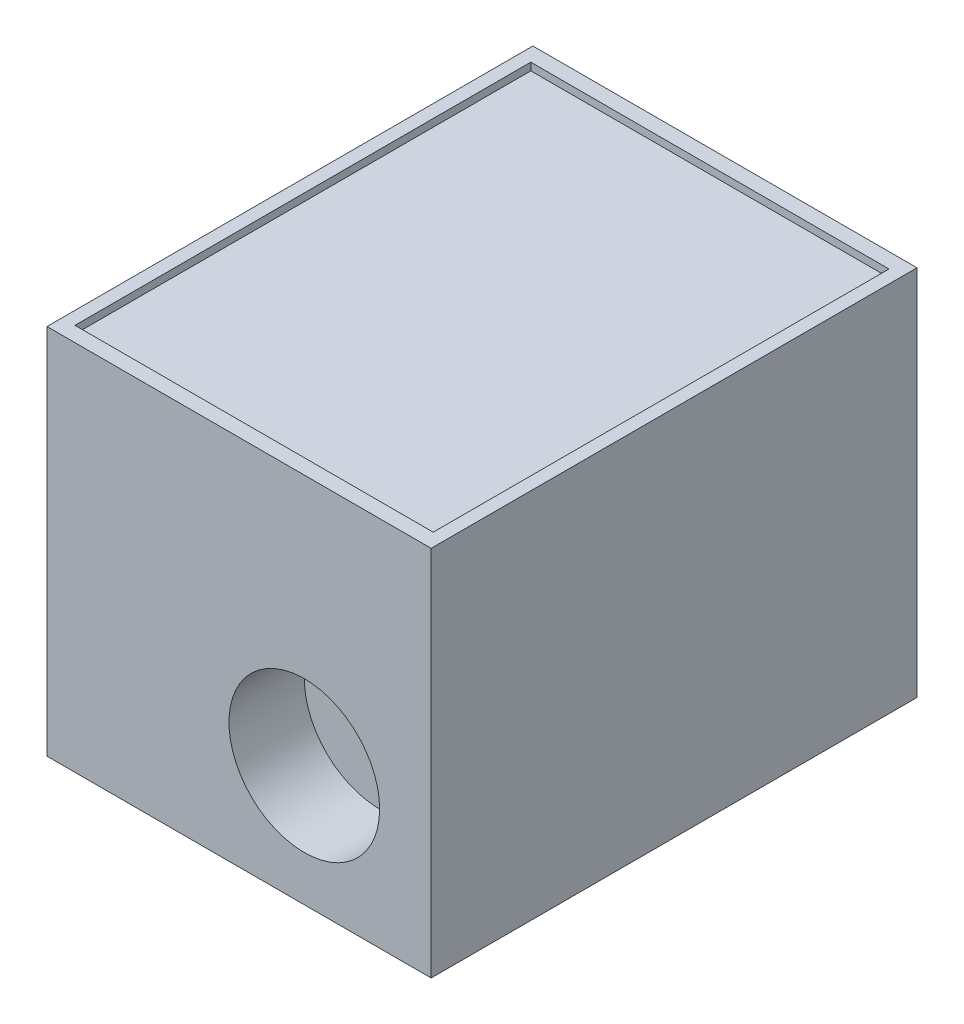
ISO-10303-21;
HEADER;
FILE_DESCRIPTION(('STEP AP214'),'2;1');
FILE_NAME('part.step','',(''),(''),'','','');
FILE_SCHEMA(('AUTOMOTIVE_DESIGN { 1 0 10303 214 1 1 1 1 }'));
ENDSEC;
DATA;
#1=APPLICATION_CONTEXT('core data for automotive mechanical design processes');
#2=APPLICATION_PROTOCOL_DEFINITION('international standard','automotive_design',2000,#1);
#3=PRODUCT_CONTEXT('',#1,'mechanical');
#4=PRODUCT('Part','Part','',(#3));
#5=PRODUCT_RELATED_PRODUCT_CATEGORY('part','',(#4));
#6=PRODUCT_DEFINITION_FORMATION('','',#4);
#7=PRODUCT_DEFINITION_CONTEXT('part definition',#1,'design');
#8=PRODUCT_DEFINITION('design','',#6,#7);
#9=PRODUCT_DEFINITION_SHAPE('','',#8);
#10=(LENGTH_UNIT() NAMED_UNIT(*) SI_UNIT(.MILLI.,.METRE.));
#11=(NAMED_UNIT(*) PLANE_ANGLE_UNIT() SI_UNIT($,.RADIAN.));
#12=(NAMED_UNIT(*) SI_UNIT($,.STERADIAN.) SOLID_ANGLE_UNIT());
#13=UNCERTAINTY_MEASURE_WITH_UNIT(LENGTH_MEASURE(1.E-05),#10,'distance_accuracy_value','');
#14=(GEOMETRIC_REPRESENTATION_CONTEXT(3) GLOBAL_UNCERTAINTY_ASSIGNED_CONTEXT((#13)) GLOBAL_UNIT_ASSIGNED_CONTEXT((#10,
#11,#12)) REPRESENTATION_CONTEXT('',''));
#15=CARTESIAN_POINT('',(0.,0.,0.));
#16=DIRECTION('',(0.,0.,1.));
#17=DIRECTION('',(1.,0.,0.));
#18=AXIS2_PLACEMENT_3D('',#15,#16,#17);
#19=CARTESIAN_POINT('',(-25.5,49.4,32.25));
#20=DIRECTION('',(1.,0.,0.));
#21=DIRECTION('',(0.,0.,-1.));
#22=AXIS2_PLACEMENT_3D('',#19,#20,#21);
#23=PLANE('',#22);
#24=DIRECTION('',(0.,0.,1.));
#25=VECTOR('',#24,1.);
#26=CARTESIAN_POINT('',(-25.5,0.,32.25));
#27=LINE('',#26,#25);
#28=CARTESIAN_POINT('',(-25.5,0.,-32.25));
#29=VERTEX_POINT('',#28);
#30=CARTESIAN_POINT('',(-25.5,0.,32.25));
#31=VERTEX_POINT('',#30);
#32=EDGE_CURVE('E152',#29,#31,#27,.T.);
#33=ORIENTED_EDGE('',*,*,#32,.T.);
#34=DIRECTION('',(0.,-1.,0.));
#35=VECTOR('',#34,1.);
#36=CARTESIAN_POINT('',(-25.5,49.4,32.25));
#37=LINE('',#36,#35);
#38=CARTESIAN_POINT('',(-25.5,49.4,32.25));
#39=VERTEX_POINT('',#38);
#40=EDGE_CURVE('E11',#39,#31,#37,.T.);
#41=ORIENTED_EDGE('',*,*,#40,.F.);
#42=DIRECTION('',(0.,0.,1.));
#43=VECTOR('',#42,1.);
#44=CARTESIAN_POINT('',(-25.5,49.4,32.25));
#45=LINE('',#44,#43);
#46=CARTESIAN_POINT('',(-25.5,49.4,-32.25));
#47=VERTEX_POINT('',#46);
#48=EDGE_CURVE('E155',#47,#39,#45,.T.);
#49=ORIENTED_EDGE('',*,*,#48,.F.);
#50=DIRECTION('',(0.,-1.,0.));
#51=VECTOR('',#50,1.);
#52=CARTESIAN_POINT('',(-25.5,49.4,-32.25));
#53=LINE('',#52,#51);
#54=EDGE_CURVE('E161',#47,#29,#53,.T.);
#55=ORIENTED_EDGE('',*,*,#54,.T.);
#56=EDGE_LOOP('',(#33,#41,#49,#55));
#57=FACE_BOUND('',#56,.T.);
#58=ADVANCED_FACE('F37',(#57),#23,.F.);
#59=CARTESIAN_POINT('',(25.5,49.4,32.25));
#60=DIRECTION('',(0.,0.,-1.));
#61=DIRECTION('',(-1.,0.,0.));
#62=AXIS2_PLACEMENT_3D('',#59,#60,#61);
#63=PLANE('',#62);
#64=CARTESIAN_POINT('',(8.66000000000001,16.,32.25));
#65=DIRECTION('',(0.,0.,1.));
#66=DIRECTION('',(1.,0.,0.));
#67=AXIS2_PLACEMENT_3D('',#64,#65,#66);
#68=CIRCLE('',#67,10.);
#69=CARTESIAN_POINT('',(18.66,16.,32.25));
#70=VERTEX_POINT('',#69);
#71=EDGE_CURVE('E145',#70,#70,#68,.T.);
#72=ORIENTED_EDGE('',*,*,#71,.F.);
#73=EDGE_LOOP('',(#72));
#74=FACE_BOUND('',#73,.T.);
#75=DIRECTION('',(1.,0.,0.));
#76=VECTOR('',#75,1.);
#77=CARTESIAN_POINT('',(25.5,0.,32.25));
#78=LINE('',#77,#76);
#79=CARTESIAN_POINT('',(25.5,0.,32.25));
#80=VERTEX_POINT('',#79);
#81=EDGE_CURVE('E164',#31,#80,#78,.T.);
#82=ORIENTED_EDGE('',*,*,#81,.T.);
#83=DIRECTION('',(0.,-1.,0.));
#84=VECTOR('',#83,1.);
#85=CARTESIAN_POINT('',(25.5,49.4,32.25));
#86=LINE('',#85,#84);
#87=CARTESIAN_POINT('',(25.5,49.4,32.25));
#88=VERTEX_POINT('',#87);
#89=EDGE_CURVE('E44',#88,#80,#86,.T.);
#90=ORIENTED_EDGE('',*,*,#89,.F.);
#91=DIRECTION('',(1.,0.,0.));
#92=VECTOR('',#91,1.);
#93=CARTESIAN_POINT('',(25.5,49.4,32.25));
#94=LINE('',#93,#92);
#95=EDGE_CURVE('E88',#39,#88,#94,.T.);
#96=ORIENTED_EDGE('',*,*,#95,.F.);
#97=ORIENTED_EDGE('',*,*,#40,.T.);
#98=EDGE_LOOP('',(#82,#90,#96,#97));
#99=FACE_BOUND('',#98,.T.);
#100=ADVANCED_FACE('F194',(#74,#99),#63,.F.);
#101=CARTESIAN_POINT('',(25.5,49.4,32.25));
#102=DIRECTION('',(-1.,0.,0.));
#103=DIRECTION('',(0.,0.,1.));
#104=AXIS2_PLACEMENT_3D('',#101,#102,#103);
#105=PLANE('',#104);
#106=DIRECTION('',(0.,0.,-1.));
#107=VECTOR('',#106,1.);
#108=CARTESIAN_POINT('',(25.5,0.,32.25));
#109=LINE('',#108,#107);
#110=CARTESIAN_POINT('',(25.5,0.,-32.25));
#111=VERTEX_POINT('',#110);
#112=EDGE_CURVE('E166',#80,#111,#109,.T.);
#113=ORIENTED_EDGE('',*,*,#112,.T.);
#114=DIRECTION('',(0.,-1.,0.));
#115=VECTOR('',#114,1.);
#116=CARTESIAN_POINT('',(25.5,49.4,-32.25));
#117=LINE('',#116,#115);
#118=CARTESIAN_POINT('',(25.5,49.4,-32.25));
#119=VERTEX_POINT('',#118);
#120=EDGE_CURVE('E170',#119,#111,#117,.T.);
#121=ORIENTED_EDGE('',*,*,#120,.F.);
#122=DIRECTION('',(0.,0.,-1.));
#123=VECTOR('',#122,1.);
#124=CARTESIAN_POINT('',(25.5,49.4,32.25));
#125=LINE('',#124,#123);
#126=EDGE_CURVE('E158',#88,#119,#125,.T.);
#127=ORIENTED_EDGE('',*,*,#126,.F.);
#128=ORIENTED_EDGE('',*,*,#89,.T.);
#129=EDGE_LOOP('',(#113,#121,#127,#128));
#130=FACE_BOUND('',#129,.T.);
#131=ADVANCED_FACE('F175',(#130),#105,.F.);
#132=CARTESIAN_POINT('',(25.5,49.4,-32.25));
#133=DIRECTION('',(0.,0.,1.));
#134=DIRECTION('',(1.,0.,0.));
#135=AXIS2_PLACEMENT_3D('',#132,#133,#134);
#136=PLANE('',#135);
#137=DIRECTION('',(-1.,0.,0.));
#138=VECTOR('',#137,1.);
#139=CARTESIAN_POINT('',(25.5,0.,-32.25));
#140=LINE('',#139,#138);
#141=EDGE_CURVE('E81',#111,#29,#140,.T.);
#142=ORIENTED_EDGE('',*,*,#141,.T.);
#143=ORIENTED_EDGE('',*,*,#54,.F.);
#144=DIRECTION('',(-1.,0.,0.));
#145=VECTOR('',#144,1.);
#146=CARTESIAN_POINT('',(25.5,49.4,-32.25));
#147=LINE('',#146,#145);
#148=EDGE_CURVE('E60',#119,#47,#147,.T.);
#149=ORIENTED_EDGE('',*,*,#148,.F.);
#150=ORIENTED_EDGE('',*,*,#120,.T.);
#151=EDGE_LOOP('',(#142,#143,#149,#150));
#152=FACE_BOUND('',#151,.T.);
#153=ADVANCED_FACE('F183',(#152),#136,.F.);
#154=CARTESIAN_POINT('',(0.,49.4,0.));
#155=DIRECTION('',(0.,1.,0.));
#156=DIRECTION('',(0.,0.,1.));
#157=AXIS2_PLACEMENT_3D('',#154,#155,#156);
#158=PLANE('',#157);
#159=DIRECTION('',(0.,0.,1.));
#160=VECTOR('',#159,1.);
#161=CARTESIAN_POINT('',(-23.7782452549145,49.4,30.2548101103388));
#162=LINE('',#161,#160);
#163=CARTESIAN_POINT('',(-23.7782452549145,49.4,-30.2548101103388));
#164=VERTEX_POINT('',#163);
#165=CARTESIAN_POINT('',(-23.7782452549145,49.4,30.2548101103388));
#166=VERTEX_POINT('',#165);
#167=EDGE_CURVE('E51',#164,#166,#162,.T.);
#168=ORIENTED_EDGE('',*,*,#167,.F.);
#169=DIRECTION('',(-1.,0.,0.));
#170=VECTOR('',#169,1.);
#171=CARTESIAN_POINT('',(23.7782452549145,49.4,-30.2548101103388));
#172=LINE('',#171,#170);
#173=CARTESIAN_POINT('',(23.7782452549145,49.4,-30.2548101103388));
#174=VERTEX_POINT('',#173);
#175=EDGE_CURVE('E130',#174,#164,#172,.T.);
#176=ORIENTED_EDGE('',*,*,#175,.F.);
#177=DIRECTION('',(0.,0.,-1.));
#178=VECTOR('',#177,1.);
#179=CARTESIAN_POINT('',(23.7782452549145,49.4,30.2548101103388));
#180=LINE('',#179,#178);
#181=CARTESIAN_POINT('',(23.7782452549145,49.4,30.2548101103388));
#182=VERTEX_POINT('',#181);
#183=EDGE_CURVE('E133',#182,#174,#180,.T.);
#184=ORIENTED_EDGE('',*,*,#183,.F.);
#185=DIRECTION('',(1.,0.,0.));
#186=VECTOR('',#185,1.);
#187=CARTESIAN_POINT('',(23.7782452549145,49.4,30.2548101103388));
#188=LINE('',#187,#186);
#189=EDGE_CURVE('E139',#166,#182,#188,.T.);
#190=ORIENTED_EDGE('',*,*,#189,.F.);
#191=EDGE_LOOP('',(#168,#176,#184,#190));
#192=FACE_BOUND('',#191,.T.);
#193=ORIENTED_EDGE('',*,*,#48,.T.);
#194=ORIENTED_EDGE('',*,*,#95,.T.);
#195=ORIENTED_EDGE('',*,*,#126,.T.);
#196=ORIENTED_EDGE('',*,*,#148,.T.);
#197=EDGE_LOOP('',(#193,#194,#195,#196));
#198=FACE_BOUND('',#197,.T.);
#199=ADVANCED_FACE('F185',(#192,#198),#158,.T.);
#200=CARTESIAN_POINT('',(0.,0.,0.));
#201=DIRECTION('',(0.,1.,0.));
#202=DIRECTION('',(0.,0.,1.));
#203=AXIS2_PLACEMENT_3D('',#200,#201,#202);
#204=PLANE('',#203);
#205=ORIENTED_EDGE('',*,*,#32,.F.);
#206=ORIENTED_EDGE('',*,*,#141,.F.);
#207=ORIENTED_EDGE('',*,*,#112,.F.);
#208=ORIENTED_EDGE('',*,*,#81,.F.);
#209=EDGE_LOOP('',(#205,#206,#207,#208));
#210=FACE_BOUND('',#209,.T.);
#211=ADVANCED_FACE('F179',(#210),#204,.F.);
#212=CARTESIAN_POINT('',(8.66000000000001,16.,22.25));
#213=DIRECTION('',(0.,0.,1.));
#214=DIRECTION('',(1.,0.,0.));
#215=AXIS2_PLACEMENT_3D('',#212,#213,#214);
#216=CYLINDRICAL_SURFACE('',#215,10.);
#217=CARTESIAN_POINT('',(8.66000000000001,16.,22.25));
#218=DIRECTION('',(0.,0.,1.));
#219=DIRECTION('',(1.,0.,0.));
#220=AXIS2_PLACEMENT_3D('',#217,#218,#219);
#221=CIRCLE('',#220,10.);
#222=CARTESIAN_POINT('',(18.66,16.,22.25));
#223=VERTEX_POINT('',#222);
#224=EDGE_CURVE('E149',#223,#223,#221,.T.);
#225=ORIENTED_EDGE('',*,*,#224,.F.);
#226=EDGE_LOOP('',(#225));
#227=FACE_BOUND('',#226,.T.);
#228=ORIENTED_EDGE('',*,*,#71,.T.);
#229=EDGE_LOOP('',(#228));
#230=FACE_BOUND('',#229,.T.);
#231=ADVANCED_FACE('F206',(#227,#230),#216,.F.);
#232=CARTESIAN_POINT('',(8.66000000000001,16.,22.25));
#233=DIRECTION('',(0.,0.,1.));
#234=DIRECTION('',(1.,0.,0.));
#235=AXIS2_PLACEMENT_3D('',#232,#233,#234);
#236=PLANE('',#235);
#237=ORIENTED_EDGE('',*,*,#224,.T.);
#238=EDGE_LOOP('',(#237));
#239=FACE_BOUND('',#238,.T.);
#240=ADVANCED_FACE('F208',(#239),#236,.T.);
#241=CARTESIAN_POINT('',(-23.7782452549145,48.4,30.2548101103388));
#242=DIRECTION('',(-1.,0.,0.));
#243=DIRECTION('',(0.,0.,1.));
#244=AXIS2_PLACEMENT_3D('',#241,#242,#243);
#245=PLANE('',#244);
#246=ORIENTED_EDGE('',*,*,#167,.T.);
#247=DIRECTION('',(0.,1.,0.));
#248=VECTOR('',#247,1.);
#249=CARTESIAN_POINT('',(-23.7782452549145,48.4,30.2548101103388));
#250=LINE('',#249,#248);
#251=CARTESIAN_POINT('',(-23.7782452549145,48.4,30.2548101103388));
#252=VERTEX_POINT('',#251);
#253=EDGE_CURVE('E108',#252,#166,#250,.T.);
#254=ORIENTED_EDGE('',*,*,#253,.F.);
#255=DIRECTION('',(0.,0.,1.));
#256=VECTOR('',#255,1.);
#257=CARTESIAN_POINT('',(-23.7782452549145,48.4,30.2548101103388));
#258=LINE('',#257,#256);
#259=CARTESIAN_POINT('',(-23.7782452549145,48.4,-30.2548101103388));
#260=VERTEX_POINT('',#259);
#261=EDGE_CURVE('E112',#260,#252,#258,.T.);
#262=ORIENTED_EDGE('',*,*,#261,.F.);
#263=DIRECTION('',(0.,1.,0.));
#264=VECTOR('',#263,1.);
#265=CARTESIAN_POINT('',(-23.7782452549145,48.4,-30.2548101103388));
#266=LINE('',#265,#264);
#267=EDGE_CURVE('E143',#260,#164,#266,.T.);
#268=ORIENTED_EDGE('',*,*,#267,.T.);
#269=EDGE_LOOP('',(#246,#254,#262,#268));
#270=FACE_BOUND('',#269,.T.);
#271=ADVANCED_FACE('F110',(#270),#245,.F.);
#272=CARTESIAN_POINT('',(23.7782452549145,48.4,-30.2548101103388));
#273=DIRECTION('',(0.,0.,-1.));
#274=DIRECTION('',(-1.,0.,0.));
#275=AXIS2_PLACEMENT_3D('',#272,#273,#274);
#276=PLANE('',#275);
#277=ORIENTED_EDGE('',*,*,#175,.T.);
#278=ORIENTED_EDGE('',*,*,#267,.F.);
#279=DIRECTION('',(-1.,0.,0.));
#280=VECTOR('',#279,1.);
#281=CARTESIAN_POINT('',(23.7782452549145,48.4,-30.2548101103388));
#282=LINE('',#281,#280);
#283=CARTESIAN_POINT('',(23.7782452549145,48.4,-30.2548101103388));
#284=VERTEX_POINT('',#283);
#285=EDGE_CURVE('E118',#284,#260,#282,.T.);
#286=ORIENTED_EDGE('',*,*,#285,.F.);
#287=DIRECTION('',(0.,1.,0.));
#288=VECTOR('',#287,1.);
#289=CARTESIAN_POINT('',(23.7782452549145,48.4,-30.2548101103388));
#290=LINE('',#289,#288);
#291=EDGE_CURVE('E146',#284,#174,#290,.T.);
#292=ORIENTED_EDGE('',*,*,#291,.T.);
#293=EDGE_LOOP('',(#277,#278,#286,#292));
#294=FACE_BOUND('',#293,.T.);
#295=ADVANCED_FACE('F221',(#294),#276,.F.);
#296=CARTESIAN_POINT('',(23.7782452549145,48.4,30.2548101103388));
#297=DIRECTION('',(1.,0.,0.));
#298=DIRECTION('',(0.,0.,-1.));
#299=AXIS2_PLACEMENT_3D('',#296,#297,#298);
#300=PLANE('',#299);
#301=ORIENTED_EDGE('',*,*,#183,.T.);
#302=ORIENTED_EDGE('',*,*,#291,.F.);
#303=DIRECTION('',(0.,0.,-1.));
#304=VECTOR('',#303,1.);
#305=CARTESIAN_POINT('',(23.7782452549145,48.4,30.2548101103388));
#306=LINE('',#305,#304);
#307=CARTESIAN_POINT('',(23.7782452549145,48.4,30.2548101103388));
#308=VERTEX_POINT('',#307);
#309=EDGE_CURVE('E126',#308,#284,#306,.T.);
#310=ORIENTED_EDGE('',*,*,#309,.F.);
#311=DIRECTION('',(0.,1.,0.));
#312=VECTOR('',#311,1.);
#313=CARTESIAN_POINT('',(23.7782452549145,48.4,30.2548101103388));
#314=LINE('',#313,#312);
#315=EDGE_CURVE('E117',#308,#182,#314,.T.);
#316=ORIENTED_EDGE('',*,*,#315,.T.);
#317=EDGE_LOOP('',(#301,#302,#310,#316));
#318=FACE_BOUND('',#317,.T.);
#319=ADVANCED_FACE('F224',(#318),#300,.F.);
#320=CARTESIAN_POINT('',(23.7782452549145,48.4,30.2548101103388));
#321=DIRECTION('',(0.,0.,1.));
#322=DIRECTION('',(1.,0.,0.));
#323=AXIS2_PLACEMENT_3D('',#320,#321,#322);
#324=PLANE('',#323);
#325=ORIENTED_EDGE('',*,*,#189,.T.);
#326=ORIENTED_EDGE('',*,*,#315,.F.);
#327=DIRECTION('',(1.,0.,0.));
#328=VECTOR('',#327,1.);
#329=CARTESIAN_POINT('',(23.7782452549145,48.4,30.2548101103388));
#330=LINE('',#329,#328);
#331=EDGE_CURVE('E121',#252,#308,#330,.T.);
#332=ORIENTED_EDGE('',*,*,#331,.F.);
#333=ORIENTED_EDGE('',*,*,#253,.T.);
#334=EDGE_LOOP('',(#325,#326,#332,#333));
#335=FACE_BOUND('',#334,.T.);
#336=ADVANCED_FACE('F122',(#335),#324,.F.);
#337=CARTESIAN_POINT('',(0.,48.4,0.));
#338=DIRECTION('',(0.,1.,0.));
#339=DIRECTION('',(0.,0.,1.));
#340=AXIS2_PLACEMENT_3D('',#337,#338,#339);
#341=PLANE('',#340);
#342=ORIENTED_EDGE('',*,*,#261,.T.);
#343=ORIENTED_EDGE('',*,*,#331,.T.);
#344=ORIENTED_EDGE('',*,*,#309,.T.);
#345=ORIENTED_EDGE('',*,*,#285,.T.);
#346=EDGE_LOOP('',(#342,#343,#344,#345));
#347=FACE_BOUND('',#346,.T.);
#348=ADVANCED_FACE('F128',(#347),#341,.T.);
#349=CLOSED_SHELL('',(#58,#100,#131,#153,#199,#211,#231,#240,#271,#295,#319,#336,#348));
#350=MANIFOLD_SOLID_BREP('B2',#349);
#351=ADVANCED_BREP_SHAPE_REPRESENTATION('',(#18,#350),#14);
#352=SHAPE_DEFINITION_REPRESENTATION(#9,#351);
ENDSEC;
END-ISO-10303-21;
